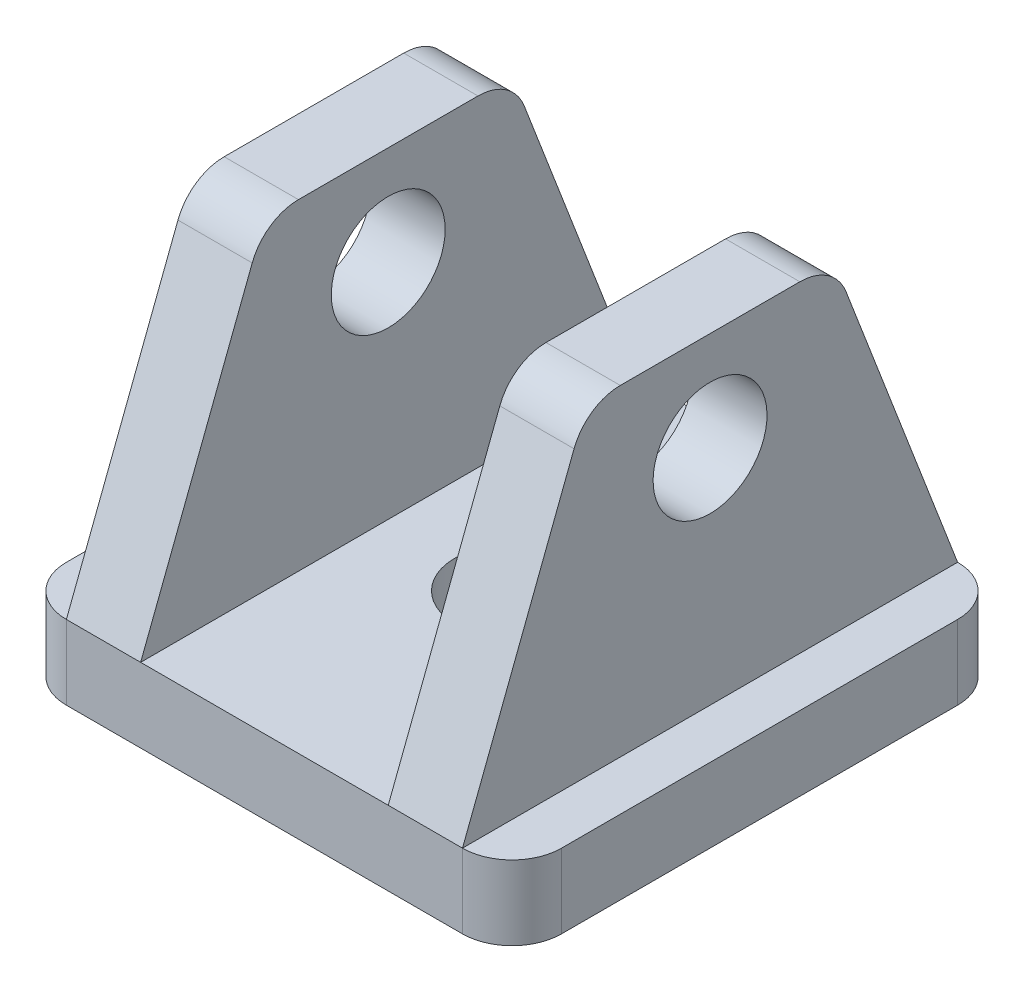
ISO-10303-21;
HEADER;
FILE_DESCRIPTION(('STEP AP214'),'2;1');
FILE_NAME('part.step','',(''),(''),'','','');
FILE_SCHEMA(('AUTOMOTIVE_DESIGN { 1 0 10303 214 1 1 1 1 }'));
ENDSEC;
DATA;
#1=APPLICATION_CONTEXT('core data for automotive mechanical design processes');
#2=APPLICATION_PROTOCOL_DEFINITION('international standard','automotive_design',2000,#1);
#3=PRODUCT_CONTEXT('',#1,'mechanical');
#4=PRODUCT('Part','Part','',(#3));
#5=PRODUCT_RELATED_PRODUCT_CATEGORY('part','',(#4));
#6=PRODUCT_DEFINITION_FORMATION('','',#4);
#7=PRODUCT_DEFINITION_CONTEXT('part definition',#1,'design');
#8=PRODUCT_DEFINITION('design','',#6,#7);
#9=PRODUCT_DEFINITION_SHAPE('','',#8);
#10=(LENGTH_UNIT() NAMED_UNIT(*) SI_UNIT(.MILLI.,.METRE.));
#11=(NAMED_UNIT(*) PLANE_ANGLE_UNIT() SI_UNIT($,.RADIAN.));
#12=(NAMED_UNIT(*) SI_UNIT($,.STERADIAN.) SOLID_ANGLE_UNIT());
#13=UNCERTAINTY_MEASURE_WITH_UNIT(LENGTH_MEASURE(1.E-05),#10,'distance_accuracy_value','');
#14=(GEOMETRIC_REPRESENTATION_CONTEXT(3) GLOBAL_UNCERTAINTY_ASSIGNED_CONTEXT((#13)) GLOBAL_UNIT_ASSIGNED_CONTEXT((#10,
#11,#12)) REPRESENTATION_CONTEXT('',''));
#15=CARTESIAN_POINT('',(0.,0.,0.));
#16=DIRECTION('',(0.,0.,1.));
#17=DIRECTION('',(1.,0.,0.));
#18=AXIS2_PLACEMENT_3D('',#15,#16,#17);
#19=CARTESIAN_POINT('',(0.,3.81,0.));
#20=DIRECTION('',(0.,-1.,0.));
#21=DIRECTION('',(0.,0.,-1.));
#22=AXIS2_PLACEMENT_3D('',#19,#20,#21);
#23=PLANE('',#22);
#24=CARTESIAN_POINT('',(22.86,3.81,-22.86));
#25=DIRECTION('',(0.,-1.,0.));
#26=DIRECTION('',(0.,0.,-1.));
#27=AXIS2_PLACEMENT_3D('',#24,#25,#26);
#28=CIRCLE('',#27,2.54);
#29=CARTESIAN_POINT('',(25.4,3.81,-22.86));
#30=VERTEX_POINT('',#29);
#31=CARTESIAN_POINT('',(22.86,3.81,-25.4));
#32=VERTEX_POINT('',#31);
#33=EDGE_CURVE('E218',#30,#32,#28,.F.);
#34=ORIENTED_EDGE('',*,*,#33,.T.);
#35=DIRECTION('',(0.,0.,1.));
#36=VECTOR('',#35,1.);
#37=CARTESIAN_POINT('',(22.86,3.81,-25.4));
#38=LINE('',#37,#36);
#39=CARTESIAN_POINT('',(22.86,3.81,0.));
#40=VERTEX_POINT('',#39);
#41=EDGE_CURVE('E199',#32,#40,#38,.T.);
#42=ORIENTED_EDGE('',*,*,#41,.T.);
#43=CARTESIAN_POINT('',(22.86,3.81,-2.54));
#44=DIRECTION('',(0.,-1.,0.));
#45=DIRECTION('',(0.,0.,-1.));
#46=AXIS2_PLACEMENT_3D('',#43,#44,#45);
#47=CIRCLE('',#46,2.54);
#48=CARTESIAN_POINT('',(25.4,3.81,-2.54));
#49=VERTEX_POINT('',#48);
#50=EDGE_CURVE('E215',#40,#49,#47,.F.);
#51=ORIENTED_EDGE('',*,*,#50,.T.);
#52=DIRECTION('',(0.,0.,-1.));
#53=VECTOR('',#52,1.);
#54=CARTESIAN_POINT('',(25.4,3.81,0.));
#55=LINE('',#54,#53);
#56=EDGE_CURVE('E414',#49,#30,#55,.T.);
#57=ORIENTED_EDGE('',*,*,#56,.T.);
#58=EDGE_LOOP('',(#34,#42,#51,#57));
#59=FACE_BOUND('',#58,.T.);
#60=ADVANCED_FACE('F59',(#59),#23,.F.);
#61=CARTESIAN_POINT('',(12.7,3.81,-12.7));
#62=DIRECTION('',(0.,1.,0.));
#63=DIRECTION('',(0.,0.,1.));
#64=AXIS2_PLACEMENT_3D('',#61,#62,#63);
#65=CIRCLE('',#64,2.921);
#66=CARTESIAN_POINT('',(12.7,3.81,-15.621));
#67=VERTEX_POINT('',#66);
#68=EDGE_CURVE('E395',#67,#67,#65,.T.);
#69=ORIENTED_EDGE('',*,*,#68,.F.);
#70=EDGE_LOOP('',(#69));
#71=FACE_BOUND('',#70,.T.);
#72=DIRECTION('',(1.,0.,0.));
#73=VECTOR('',#72,1.);
#74=CARTESIAN_POINT('',(0.,3.81,0.));
#75=LINE('',#74,#73);
#76=CARTESIAN_POINT('',(6.35,3.81,0.));
#77=VERTEX_POINT('',#76);
#78=CARTESIAN_POINT('',(19.05,3.81,0.));
#79=VERTEX_POINT('',#78);
#80=EDGE_CURVE('E410',#77,#79,#75,.T.);
#81=ORIENTED_EDGE('',*,*,#80,.T.);
#82=DIRECTION('',(0.,0.,1.));
#83=VECTOR('',#82,1.);
#84=CARTESIAN_POINT('',(19.05,3.81,-25.4));
#85=LINE('',#84,#83);
#86=CARTESIAN_POINT('',(19.05,3.81,-25.4));
#87=VERTEX_POINT('',#86);
#88=EDGE_CURVE('E200',#87,#79,#85,.T.);
#89=ORIENTED_EDGE('',*,*,#88,.F.);
#90=DIRECTION('',(-1.,0.,0.));
#91=VECTOR('',#90,1.);
#92=CARTESIAN_POINT('',(0.,3.81,-25.4));
#93=LINE('',#92,#91);
#94=CARTESIAN_POINT('',(6.35,3.81,-25.4));
#95=VERTEX_POINT('',#94);
#96=EDGE_CURVE('E258',#87,#95,#93,.T.);
#97=ORIENTED_EDGE('',*,*,#96,.T.);
#98=DIRECTION('',(0.,0.,1.));
#99=VECTOR('',#98,1.);
#100=CARTESIAN_POINT('',(6.35,3.81,-25.4));
#101=LINE('',#100,#99);
#102=EDGE_CURVE('E451',#95,#77,#101,.T.);
#103=ORIENTED_EDGE('',*,*,#102,.T.);
#104=EDGE_LOOP('',(#81,#89,#97,#103));
#105=FACE_BOUND('',#104,.T.);
#106=ADVANCED_FACE('F468',(#71,#105),#23,.F.);
#107=CARTESIAN_POINT('',(2.54,3.81,-2.54));
#108=DIRECTION('',(0.,-1.,0.));
#109=DIRECTION('',(0.,0.,-1.));
#110=AXIS2_PLACEMENT_3D('',#107,#108,#109);
#111=CIRCLE('',#110,2.54);
#112=CARTESIAN_POINT('',(0.,3.81,-2.54));
#113=VERTEX_POINT('',#112);
#114=CARTESIAN_POINT('',(2.54,3.81,0.));
#115=VERTEX_POINT('',#114);
#116=EDGE_CURVE('E237',#113,#115,#111,.F.);
#117=ORIENTED_EDGE('',*,*,#116,.T.);
#118=DIRECTION('',(0.,0.,1.));
#119=VECTOR('',#118,1.);
#120=CARTESIAN_POINT('',(2.54,3.81,-25.4));
#121=LINE('',#120,#119);
#122=CARTESIAN_POINT('',(2.54,3.81,-25.4));
#123=VERTEX_POINT('',#122);
#124=EDGE_CURVE('E447',#123,#115,#121,.T.);
#125=ORIENTED_EDGE('',*,*,#124,.F.);
#126=CARTESIAN_POINT('',(2.54,3.81,-22.86));
#127=DIRECTION('',(0.,-1.,0.));
#128=DIRECTION('',(0.,0.,-1.));
#129=AXIS2_PLACEMENT_3D('',#126,#127,#128);
#130=CIRCLE('',#129,2.54);
#131=CARTESIAN_POINT('',(0.,3.81,-22.86));
#132=VERTEX_POINT('',#131);
#133=EDGE_CURVE('E239',#123,#132,#130,.F.);
#134=ORIENTED_EDGE('',*,*,#133,.T.);
#135=DIRECTION('',(0.,0.,1.));
#136=VECTOR('',#135,1.);
#137=CARTESIAN_POINT('',(0.,3.81,0.));
#138=LINE('',#137,#136);
#139=EDGE_CURVE('E407',#132,#113,#138,.T.);
#140=ORIENTED_EDGE('',*,*,#139,.T.);
#141=EDGE_LOOP('',(#117,#125,#134,#140));
#142=FACE_BOUND('',#141,.T.);
#143=ADVANCED_FACE('F489',(#142),#23,.F.);
#144=CARTESIAN_POINT('',(0.,0.,0.));
#145=DIRECTION('',(0.,-1.,0.));
#146=DIRECTION('',(0.,0.,-1.));
#147=AXIS2_PLACEMENT_3D('',#144,#145,#146);
#148=PLANE('',#147);
#149=DIRECTION('',(0.,0.,1.));
#150=VECTOR('',#149,1.);
#151=CARTESIAN_POINT('',(0.,0.,0.));
#152=LINE('',#151,#150);
#153=CARTESIAN_POINT('',(0.,0.,-22.86));
#154=VERTEX_POINT('',#153);
#155=CARTESIAN_POINT('',(0.,0.,-2.54));
#156=VERTEX_POINT('',#155);
#157=EDGE_CURVE('E403',#154,#156,#152,.T.);
#158=ORIENTED_EDGE('',*,*,#157,.F.);
#159=CARTESIAN_POINT('',(2.54,0.,-22.86));
#160=DIRECTION('',(0.,-1.,0.));
#161=DIRECTION('',(0.,0.,-1.));
#162=AXIS2_PLACEMENT_3D('',#159,#160,#161);
#163=CIRCLE('',#162,2.54);
#164=CARTESIAN_POINT('',(2.54,0.,-25.4));
#165=VERTEX_POINT('',#164);
#166=EDGE_CURVE('E423',#154,#165,#163,.T.);
#167=ORIENTED_EDGE('',*,*,#166,.T.);
#168=DIRECTION('',(-1.,0.,0.));
#169=VECTOR('',#168,1.);
#170=CARTESIAN_POINT('',(0.,0.,-25.4));
#171=LINE('',#170,#169);
#172=CARTESIAN_POINT('',(22.86,0.,-25.4));
#173=VERTEX_POINT('',#172);
#174=EDGE_CURVE('E411',#173,#165,#171,.T.);
#175=ORIENTED_EDGE('',*,*,#174,.F.);
#176=CARTESIAN_POINT('',(22.86,0.,-22.86));
#177=DIRECTION('',(0.,-1.,0.));
#178=DIRECTION('',(0.,0.,-1.));
#179=AXIS2_PLACEMENT_3D('',#176,#177,#178);
#180=CIRCLE('',#179,2.54);
#181=CARTESIAN_POINT('',(25.4,0.,-22.86));
#182=VERTEX_POINT('',#181);
#183=EDGE_CURVE('E430',#173,#182,#180,.T.);
#184=ORIENTED_EDGE('',*,*,#183,.T.);
#185=DIRECTION('',(0.,0.,-1.));
#186=VECTOR('',#185,1.);
#187=CARTESIAN_POINT('',(25.4,0.,0.));
#188=LINE('',#187,#186);
#189=CARTESIAN_POINT('',(25.4,0.,-2.54));
#190=VERTEX_POINT('',#189);
#191=EDGE_CURVE('E506',#190,#182,#188,.T.);
#192=ORIENTED_EDGE('',*,*,#191,.F.);
#193=CARTESIAN_POINT('',(22.86,0.,-2.54));
#194=DIRECTION('',(0.,-1.,0.));
#195=DIRECTION('',(0.,0.,-1.));
#196=AXIS2_PLACEMENT_3D('',#193,#194,#195);
#197=CIRCLE('',#196,2.54);
#198=CARTESIAN_POINT('',(22.86,0.,0.));
#199=VERTEX_POINT('',#198);
#200=EDGE_CURVE('E434',#190,#199,#197,.T.);
#201=ORIENTED_EDGE('',*,*,#200,.T.);
#202=DIRECTION('',(1.,0.,0.));
#203=VECTOR('',#202,1.);
#204=CARTESIAN_POINT('',(0.,0.,0.));
#205=LINE('',#204,#203);
#206=CARTESIAN_POINT('',(2.54,0.,0.));
#207=VERTEX_POINT('',#206);
#208=EDGE_CURVE('E228',#207,#199,#205,.T.);
#209=ORIENTED_EDGE('',*,*,#208,.F.);
#210=CARTESIAN_POINT('',(2.54,0.,-2.54));
#211=DIRECTION('',(0.,-1.,0.));
#212=DIRECTION('',(0.,0.,-1.));
#213=AXIS2_PLACEMENT_3D('',#210,#211,#212);
#214=CIRCLE('',#213,2.54);
#215=EDGE_CURVE('E497',#207,#156,#214,.T.);
#216=ORIENTED_EDGE('',*,*,#215,.T.);
#217=EDGE_LOOP('',(#158,#167,#175,#184,#192,#201,#209,#216));
#218=FACE_BOUND('',#217,.T.);
#219=CARTESIAN_POINT('',(12.7,0.,-12.7));
#220=DIRECTION('',(0.,1.,0.));
#221=DIRECTION('',(0.,0.,1.));
#222=AXIS2_PLACEMENT_3D('',#219,#220,#221);
#223=CIRCLE('',#222,2.921);
#224=CARTESIAN_POINT('',(12.7,0.,-15.621));
#225=VERTEX_POINT('',#224);
#226=EDGE_CURVE('E404',#225,#225,#223,.T.);
#227=ORIENTED_EDGE('',*,*,#226,.T.);
#228=EDGE_LOOP('',(#227));
#229=FACE_BOUND('',#228,.T.);
#230=ADVANCED_FACE('F503',(#218,#229),#148,.T.);
#231=CARTESIAN_POINT('',(0.,3.81,0.));
#232=DIRECTION('',(1.,0.,0.));
#233=DIRECTION('',(0.,0.,-1.));
#234=AXIS2_PLACEMENT_3D('',#231,#232,#233);
#235=PLANE('',#234);
#236=ORIENTED_EDGE('',*,*,#139,.F.);
#237=DIRECTION('',(0.,-1.,0.));
#238=VECTOR('',#237,1.);
#239=CARTESIAN_POINT('',(0.,3.81,-22.86));
#240=LINE('',#239,#238);
#241=EDGE_CURVE('E486',#132,#154,#240,.T.);
#242=ORIENTED_EDGE('',*,*,#241,.T.);
#243=ORIENTED_EDGE('',*,*,#157,.T.);
#244=DIRECTION('',(0.,-1.,0.));
#245=VECTOR('',#244,1.);
#246=CARTESIAN_POINT('',(0.,3.81,-2.54));
#247=LINE('',#246,#245);
#248=EDGE_CURVE('E257',#156,#113,#247,.F.);
#249=ORIENTED_EDGE('',*,*,#248,.T.);
#250=EDGE_LOOP('',(#236,#242,#243,#249));
#251=FACE_BOUND('',#250,.T.);
#252=ADVANCED_FACE('F492',(#251),#235,.F.);
#253=CARTESIAN_POINT('',(0.,3.81,0.));
#254=DIRECTION('',(0.,0.,-1.));
#255=DIRECTION('',(-1.,0.,0.));
#256=AXIS2_PLACEMENT_3D('',#253,#254,#255);
#257=PLANE('',#256);
#258=ORIENTED_EDGE('',*,*,#208,.T.);
#259=DIRECTION('',(0.,-1.,0.));
#260=VECTOR('',#259,1.);
#261=CARTESIAN_POINT('',(22.86,3.81,0.));
#262=LINE('',#261,#260);
#263=EDGE_CURVE('E224',#199,#40,#262,.F.);
#264=ORIENTED_EDGE('',*,*,#263,.T.);
#265=DIRECTION('',(-1.,0.,0.));
#266=VECTOR('',#265,1.);
#267=CARTESIAN_POINT('',(22.86,3.81,0.));
#268=LINE('',#267,#266);
#269=EDGE_CURVE('E188',#40,#79,#268,.T.);
#270=ORIENTED_EDGE('',*,*,#269,.T.);
#271=ORIENTED_EDGE('',*,*,#80,.F.);
#272=DIRECTION('',(1.,0.,0.));
#273=VECTOR('',#272,1.);
#274=CARTESIAN_POINT('',(0.,3.81,0.));
#275=LINE('',#274,#273);
#276=EDGE_CURVE('E418',#115,#77,#275,.T.);
#277=ORIENTED_EDGE('',*,*,#276,.F.);
#278=DIRECTION('',(0.,-1.,0.));
#279=VECTOR('',#278,1.);
#280=CARTESIAN_POINT('',(2.54,3.81,0.));
#281=LINE('',#280,#279);
#282=EDGE_CURVE('E231',#115,#207,#281,.T.);
#283=ORIENTED_EDGE('',*,*,#282,.T.);
#284=EDGE_LOOP('',(#258,#264,#270,#271,#277,#283));
#285=FACE_BOUND('',#284,.T.);
#286=ADVANCED_FACE('F225',(#285),#257,.F.);
#287=CARTESIAN_POINT('',(25.4,3.81,0.));
#288=DIRECTION('',(-1.,0.,0.));
#289=DIRECTION('',(0.,0.,1.));
#290=AXIS2_PLACEMENT_3D('',#287,#288,#289);
#291=PLANE('',#290);
#292=ORIENTED_EDGE('',*,*,#191,.T.);
#293=DIRECTION('',(0.,-1.,0.));
#294=VECTOR('',#293,1.);
#295=CARTESIAN_POINT('',(25.4,3.81,-22.86));
#296=LINE('',#295,#294);
#297=EDGE_CURVE('E439',#182,#30,#296,.F.);
#298=ORIENTED_EDGE('',*,*,#297,.T.);
#299=ORIENTED_EDGE('',*,*,#56,.F.);
#300=DIRECTION('',(0.,-1.,0.));
#301=VECTOR('',#300,1.);
#302=CARTESIAN_POINT('',(25.4,3.81,-2.54));
#303=LINE('',#302,#301);
#304=EDGE_CURVE('E236',#49,#190,#303,.T.);
#305=ORIENTED_EDGE('',*,*,#304,.T.);
#306=EDGE_LOOP('',(#292,#298,#299,#305));
#307=FACE_BOUND('',#306,.T.);
#308=ADVANCED_FACE('F508',(#307),#291,.F.);
#309=CARTESIAN_POINT('',(0.,3.81,-25.4));
#310=DIRECTION('',(0.,0.,1.));
#311=DIRECTION('',(1.,0.,0.));
#312=AXIS2_PLACEMENT_3D('',#309,#310,#311);
#313=PLANE('',#312);
#314=ORIENTED_EDGE('',*,*,#174,.T.);
#315=DIRECTION('',(0.,-1.,0.));
#316=VECTOR('',#315,1.);
#317=CARTESIAN_POINT('',(2.54,3.81,-25.4));
#318=LINE('',#317,#316);
#319=EDGE_CURVE('E242',#165,#123,#318,.F.);
#320=ORIENTED_EDGE('',*,*,#319,.T.);
#321=DIRECTION('',(1.,0.,0.));
#322=VECTOR('',#321,1.);
#323=CARTESIAN_POINT('',(2.54,3.81,-25.4));
#324=LINE('',#323,#322);
#325=EDGE_CURVE('E456',#123,#95,#324,.T.);
#326=ORIENTED_EDGE('',*,*,#325,.T.);
#327=ORIENTED_EDGE('',*,*,#96,.F.);
#328=DIRECTION('',(1.,0.,0.));
#329=VECTOR('',#328,1.);
#330=CARTESIAN_POINT('',(0.,3.81,-25.4));
#331=LINE('',#330,#329);
#332=EDGE_CURVE('E255',#32,#87,#331,.F.);
#333=ORIENTED_EDGE('',*,*,#332,.F.);
#334=DIRECTION('',(0.,-1.,0.));
#335=VECTOR('',#334,1.);
#336=CARTESIAN_POINT('',(22.86,3.81,-25.4));
#337=LINE('',#336,#335);
#338=EDGE_CURVE('E421',#32,#173,#337,.T.);
#339=ORIENTED_EDGE('',*,*,#338,.T.);
#340=EDGE_LOOP('',(#314,#320,#326,#327,#333,#339));
#341=FACE_BOUND('',#340,.T.);
#342=ADVANCED_FACE('F479',(#341),#313,.F.);
#343=CARTESIAN_POINT('',(12.7,3.81,-12.7));
#344=DIRECTION('',(0.,-1.,0.));
#345=DIRECTION('',(0.,0.,-1.));
#346=AXIS2_PLACEMENT_3D('',#343,#344,#345);
#347=CYLINDRICAL_SURFACE('',#346,2.921);
#348=CARTESIAN_POINT('',(12.7,3.81,-15.621));
#349=CARTESIAN_POINT('',(12.7,3.7703125,-15.621));
#350=CARTESIAN_POINT('',(12.7,3.730625,-15.621));
#351=CARTESIAN_POINT('',(12.7,3.65125,-15.621));
#352=CARTESIAN_POINT('',(12.7,3.6115625,-15.621));
#353=CARTESIAN_POINT('',(12.7,3.5321875,-15.621));
#354=CARTESIAN_POINT('',(12.7,3.4925,-15.621));
#355=CARTESIAN_POINT('',(12.7,3.413125,-15.621));
#356=CARTESIAN_POINT('',(12.7,3.3734375,-15.621));
#357=CARTESIAN_POINT('',(12.7,3.2940625,-15.621));
#358=CARTESIAN_POINT('',(12.7,3.254375,-15.621));
#359=CARTESIAN_POINT('',(12.7,3.175,-15.621));
#360=CARTESIAN_POINT('',(12.7,3.1353125,-15.621));
#361=CARTESIAN_POINT('',(12.7,3.0559375,-15.621));
#362=CARTESIAN_POINT('',(12.7,3.01625,-15.621));
#363=CARTESIAN_POINT('',(12.7,2.936875,-15.621));
#364=CARTESIAN_POINT('',(12.7,2.8971875,-15.621));
#365=CARTESIAN_POINT('',(12.7,2.8178125,-15.621));
#366=CARTESIAN_POINT('',(12.7,2.778125,-15.621));
#367=CARTESIAN_POINT('',(12.7,2.69875,-15.621));
#368=CARTESIAN_POINT('',(12.7,2.6590625,-15.621));
#369=CARTESIAN_POINT('',(12.7,2.5796875,-15.621));
#370=CARTESIAN_POINT('',(12.7,2.54,-15.621));
#371=CARTESIAN_POINT('',(12.7,2.460625,-15.621));
#372=CARTESIAN_POINT('',(12.7,2.4209375,-15.621));
#373=CARTESIAN_POINT('',(12.7,2.3415625,-15.621));
#374=CARTESIAN_POINT('',(12.7,2.301875,-15.621));
#375=CARTESIAN_POINT('',(12.7,2.2225,-15.621));
#376=CARTESIAN_POINT('',(12.7,2.1828125,-15.621));
#377=CARTESIAN_POINT('',(12.7,2.1034375,-15.621));
#378=CARTESIAN_POINT('',(12.7,2.06375,-15.621));
#379=CARTESIAN_POINT('',(12.7,1.984375,-15.621));
#380=CARTESIAN_POINT('',(12.7,1.9446875,-15.621));
#381=CARTESIAN_POINT('',(12.7,1.8653125,-15.621));
#382=CARTESIAN_POINT('',(12.7,1.825625,-15.621));
#383=CARTESIAN_POINT('',(12.7,1.74625,-15.621));
#384=CARTESIAN_POINT('',(12.7,1.7065625,-15.621));
#385=CARTESIAN_POINT('',(12.7,1.6271875,-15.621));
#386=CARTESIAN_POINT('',(12.7,1.5875,-15.621));
#387=CARTESIAN_POINT('',(12.7,1.508125,-15.621));
#388=CARTESIAN_POINT('',(12.7,1.4684375,-15.621));
#389=CARTESIAN_POINT('',(12.7,1.3890625,-15.621));
#390=CARTESIAN_POINT('',(12.7,1.349375,-15.621));
#391=CARTESIAN_POINT('',(12.7,1.27,-15.621));
#392=CARTESIAN_POINT('',(12.7,1.2303125,-15.621));
#393=CARTESIAN_POINT('',(12.7,1.1509375,-15.621));
#394=CARTESIAN_POINT('',(12.7,1.11125,-15.621));
#395=CARTESIAN_POINT('',(12.7,1.031875,-15.621));
#396=CARTESIAN_POINT('',(12.7,0.9921875,-15.621));
#397=CARTESIAN_POINT('',(12.7,0.9128125,-15.621));
#398=CARTESIAN_POINT('',(12.7,0.873125,-15.621));
#399=CARTESIAN_POINT('',(12.7,0.79375,-15.621));
#400=CARTESIAN_POINT('',(12.7,0.7540625,-15.621));
#401=CARTESIAN_POINT('',(12.7,0.6746875,-15.621));
#402=CARTESIAN_POINT('',(12.7,0.635,-15.621));
#403=CARTESIAN_POINT('',(12.7,0.555625,-15.621));
#404=CARTESIAN_POINT('',(12.7,0.5159375,-15.621));
#405=CARTESIAN_POINT('',(12.7,0.4365625,-15.621));
#406=CARTESIAN_POINT('',(12.7,0.396875,-15.621));
#407=CARTESIAN_POINT('',(12.7,0.3175,-15.621));
#408=CARTESIAN_POINT('',(12.7,0.2778125,-15.621));
#409=CARTESIAN_POINT('',(12.7,0.1984375,-15.621));
#410=CARTESIAN_POINT('',(12.7,0.15875,-15.621));
#411=CARTESIAN_POINT('',(12.7,0.0793749999999999,-15.621));
#412=CARTESIAN_POINT('',(12.7,0.0396874999999999,-15.621));
#413=CARTESIAN_POINT('',(12.7,0.,-15.621));
#414=B_SPLINE_CURVE_WITH_KNOTS('',3,(#348,#349,#350,#351,#352,#353,#354,#355,#356,#357,#358,
#359,#360,#361,#362,#363,#364,#365,#366,#367,#368,#369,#370,#371,#372,#373,#374,#375,#376,#377,
#378,#379,#380,#381,#382,#383,#384,#385,#386,#387,#388,#389,#390,#391,#392,#393,#394,#395,#396,
#397,#398,#399,#400,#401,#402,#403,#404,#405,#406,#407,#408,#409,#410,#411,#412,#413),
.UNSPECIFIED.,.F.,.F.,(4,2,2,2,2,2,2,2,2,2,2,2,2,2,2,2,2,2,2,2,2,2,2,2,2,2,2,2,2,2,2,2,4),(0.,
0.1190625,0.238125,0.3571875,0.47625,0.595312499999999,0.714375,0.833437499999999,
0.952499999999999,1.0715625,1.190625,1.3096875,1.42875,1.5478125,1.666875,1.7859375,1.905,
2.0240625,2.143125,2.2621875,2.38125,2.5003125,2.619375,2.7384375,2.8575,2.9765625,3.095625,
3.2146875,3.33375,3.4528125,3.571875,3.6909375,3.81),.UNSPECIFIED.);
#415=EDGE_CURVE('BSEAM389',#67,#225,#414,.T.);
#416=ORIENTED_EDGE('',*,*,#68,.T.);
#417=ORIENTED_EDGE('',*,*,#226,.F.);
#418=ORIENTED_EDGE('',*,*,#415,.T.);
#419=ORIENTED_EDGE('',*,*,#415,.F.);
#420=EDGE_LOOP('',(#416,#418,#417,#419));
#421=FACE_BOUND('',#420,.T.);
#422=ADVANCED_FACE('F389',(#421),#347,.F.);
#423=CARTESIAN_POINT('',(2.54,3.81,-22.86));
#424=DIRECTION('',(0.,-1.,0.));
#425=DIRECTION('',(0.,0.,-1.));
#426=AXIS2_PLACEMENT_3D('',#423,#424,#425);
#427=CYLINDRICAL_SURFACE('',#426,2.54);
#428=ORIENTED_EDGE('',*,*,#133,.F.);
#429=ORIENTED_EDGE('',*,*,#319,.F.);
#430=ORIENTED_EDGE('',*,*,#166,.F.);
#431=ORIENTED_EDGE('',*,*,#241,.F.);
#432=EDGE_LOOP('',(#428,#429,#430,#431));
#433=FACE_BOUND('',#432,.T.);
#434=ADVANCED_FACE('F484',(#433),#427,.T.);
#435=CARTESIAN_POINT('',(22.86,3.81,-22.86));
#436=DIRECTION('',(0.,-1.,0.));
#437=DIRECTION('',(0.,0.,-1.));
#438=AXIS2_PLACEMENT_3D('',#435,#436,#437);
#439=CYLINDRICAL_SURFACE('',#438,2.54);
#440=ORIENTED_EDGE('',*,*,#33,.F.);
#441=ORIENTED_EDGE('',*,*,#297,.F.);
#442=ORIENTED_EDGE('',*,*,#183,.F.);
#443=ORIENTED_EDGE('',*,*,#338,.F.);
#444=EDGE_LOOP('',(#440,#441,#442,#443));
#445=FACE_BOUND('',#444,.T.);
#446=ADVANCED_FACE('F511',(#445),#439,.T.);
#447=CARTESIAN_POINT('',(22.86,3.81,-2.54));
#448=DIRECTION('',(0.,-1.,0.));
#449=DIRECTION('',(0.,0.,-1.));
#450=AXIS2_PLACEMENT_3D('',#447,#448,#449);
#451=CYLINDRICAL_SURFACE('',#450,2.54);
#452=ORIENTED_EDGE('',*,*,#50,.F.);
#453=ORIENTED_EDGE('',*,*,#263,.F.);
#454=ORIENTED_EDGE('',*,*,#200,.F.);
#455=ORIENTED_EDGE('',*,*,#304,.F.);
#456=EDGE_LOOP('',(#452,#453,#454,#455));
#457=FACE_BOUND('',#456,.T.);
#458=ADVANCED_FACE('F234',(#457),#451,.T.);
#459=CARTESIAN_POINT('',(2.54,3.81,-2.54));
#460=DIRECTION('',(0.,-1.,0.));
#461=DIRECTION('',(0.,0.,-1.));
#462=AXIS2_PLACEMENT_3D('',#459,#460,#461);
#463=CYLINDRICAL_SURFACE('',#462,2.54);
#464=ORIENTED_EDGE('',*,*,#116,.F.);
#465=ORIENTED_EDGE('',*,*,#248,.F.);
#466=ORIENTED_EDGE('',*,*,#215,.F.);
#467=ORIENTED_EDGE('',*,*,#282,.F.);
#468=EDGE_LOOP('',(#464,#465,#466,#467));
#469=FACE_BOUND('',#468,.T.);
#470=ADVANCED_FACE('F385',(#469),#463,.T.);
#471=CARTESIAN_POINT('',(0.,20.32,0.));
#472=DIRECTION('',(0.,-1.,0.));
#473=DIRECTION('',(0.,0.,-1.));
#474=AXIS2_PLACEMENT_3D('',#471,#472,#473);
#475=PLANE('',#474);
#476=DIRECTION('',(0.,0.,1.));
#477=VECTOR('',#476,1.);
#478=CARTESIAN_POINT('',(6.35,20.32,-19.05));
#479=LINE('',#478,#477);
#480=CARTESIAN_POINT('',(6.35,20.32,-17.3055302904579));
#481=VERTEX_POINT('',#480);
#482=CARTESIAN_POINT('',(6.35,20.32,-8.09446970954213));
#483=VERTEX_POINT('',#482);
#484=EDGE_CURVE('E353',#481,#483,#479,.T.);
#485=ORIENTED_EDGE('',*,*,#484,.F.);
#486=DIRECTION('',(1.,0.,0.));
#487=VECTOR('',#486,1.);
#488=CARTESIAN_POINT('',(2.54,20.32,-17.3055302904579));
#489=LINE('',#488,#487);
#490=CARTESIAN_POINT('',(2.54,20.32,-17.3055302904579));
#491=VERTEX_POINT('',#490);
#492=EDGE_CURVE('E737',#481,#491,#489,.F.);
#493=ORIENTED_EDGE('',*,*,#492,.T.);
#494=DIRECTION('',(0.,0.,1.));
#495=VECTOR('',#494,1.);
#496=CARTESIAN_POINT('',(2.54,20.32,-19.05));
#497=LINE('',#496,#495);
#498=CARTESIAN_POINT('',(2.54,20.32,-8.09446970954213));
#499=VERTEX_POINT('',#498);
#500=EDGE_CURVE('E63',#491,#499,#497,.T.);
#501=ORIENTED_EDGE('',*,*,#500,.T.);
#502=DIRECTION('',(1.,0.,0.));
#503=VECTOR('',#502,1.);
#504=CARTESIAN_POINT('',(0.,20.32,-8.09446970954213));
#505=LINE('',#504,#503);
#506=EDGE_CURVE('E736',#499,#483,#505,.T.);
#507=ORIENTED_EDGE('',*,*,#506,.T.);
#508=EDGE_LOOP('',(#485,#493,#501,#507));
#509=FACE_BOUND('',#508,.T.);
#510=ADVANCED_FACE('F376',(#509),#475,.F.);
#511=CARTESIAN_POINT('',(6.35,0.,0.));
#512=DIRECTION('',(1.,0.,0.));
#513=DIRECTION('',(0.,0.,-1.));
#514=AXIS2_PLACEMENT_3D('',#511,#512,#513);
#515=PLANE('',#514);
#516=CARTESIAN_POINT('',(6.35,15.24,-12.7));
#517=DIRECTION('',(1.,0.,0.));
#518=DIRECTION('',(0.,0.,-1.));
#519=AXIS2_PLACEMENT_3D('',#516,#517,#518);
#520=CIRCLE('',#519,2.921);
#521=CARTESIAN_POINT('',(6.35,15.24,-15.621));
#522=VERTEX_POINT('',#521);
#523=EDGE_CURVE('E250',#522,#522,#520,.T.);
#524=ORIENTED_EDGE('',*,*,#523,.F.);
#525=EDGE_LOOP('',(#524));
#526=FACE_BOUND('',#525,.T.);
#527=DIRECTION('',(0.,0.93334560620306,0.358979079308869));
#528=VECTOR('',#527,1.);
#529=CARTESIAN_POINT('',(6.35,3.81,-25.4));
#530=LINE('',#529,#528);
#531=CARTESIAN_POINT('',(6.35,18.6918068614445,-19.6762281302136));
#532=VERTEX_POINT('',#531);
#533=EDGE_CURVE('E450',#95,#532,#530,.T.);
#534=ORIENTED_EDGE('',*,*,#533,.T.);
#535=CARTESIAN_POINT('',(6.35,17.78,-17.3055302904579));
#536=DIRECTION('',(1.,0.,0.));
#537=DIRECTION('',(0.,0.,-1.));
#538=AXIS2_PLACEMENT_3D('',#535,#536,#537);
#539=CIRCLE('',#538,2.54);
#540=EDGE_CURVE('E760',#532,#481,#539,.T.);
#541=ORIENTED_EDGE('',*,*,#540,.T.);
#542=ORIENTED_EDGE('',*,*,#484,.T.);
#543=CARTESIAN_POINT('',(6.35,17.78,-8.09446970954213));
#544=DIRECTION('',(1.,0.,0.));
#545=DIRECTION('',(0.,0.,-1.));
#546=AXIS2_PLACEMENT_3D('',#543,#544,#545);
#547=CIRCLE('',#546,2.54);
#548=CARTESIAN_POINT('',(6.35,18.6918068614445,-5.72377186978636));
#549=VERTEX_POINT('',#548);
#550=EDGE_CURVE('E347',#483,#549,#547,.T.);
#551=ORIENTED_EDGE('',*,*,#550,.T.);
#552=DIRECTION('',(0.,0.93334560620306,-0.358979079308869));
#553=VECTOR('',#552,1.);
#554=CARTESIAN_POINT('',(6.35,3.81,0.));
#555=LINE('',#554,#553);
#556=EDGE_CURVE('E471',#77,#549,#555,.T.);
#557=ORIENTED_EDGE('',*,*,#556,.F.);
#558=ORIENTED_EDGE('',*,*,#102,.F.);
#559=EDGE_LOOP('',(#534,#541,#542,#551,#557,#558));
#560=FACE_BOUND('',#559,.T.);
#561=ADVANCED_FACE('F299',(#526,#560),#515,.T.);
#562=CARTESIAN_POINT('',(0.,0.4909793814433,1.27654639175258));
#563=DIRECTION('',(0.,-0.358979079308869,-0.93334560620306));
#564=DIRECTION('',(0.,0.93334560620306,-0.358979079308869));
#565=AXIS2_PLACEMENT_3D('',#562,#563,#564);
#566=PLANE('',#565);
#567=ORIENTED_EDGE('',*,*,#556,.T.);
#568=DIRECTION('',(1.,0.,0.));
#569=VECTOR('',#568,1.);
#570=CARTESIAN_POINT('',(0.,18.6918068614445,-5.72377186978636));
#571=LINE('',#570,#569);
#572=CARTESIAN_POINT('',(2.54,18.6918068614445,-5.72377186978636));
#573=VERTEX_POINT('',#572);
#574=EDGE_CURVE('E12',#549,#573,#571,.F.);
#575=ORIENTED_EDGE('',*,*,#574,.T.);
#576=DIRECTION('',(0.,0.93334560620306,-0.358979079308869));
#577=VECTOR('',#576,1.);
#578=CARTESIAN_POINT('',(2.54,3.81,0.));
#579=LINE('',#578,#577);
#580=EDGE_CURVE('E749',#115,#573,#579,.T.);
#581=ORIENTED_EDGE('',*,*,#580,.F.);
#582=ORIENTED_EDGE('',*,*,#276,.T.);
#583=EDGE_LOOP('',(#567,#575,#581,#582));
#584=FACE_BOUND('',#583,.T.);
#585=ADVANCED_FACE('F611',(#584),#566,.F.);
#586=CARTESIAN_POINT('',(0.,9.00128865979382,-23.4033505154639));
#587=DIRECTION('',(0.,0.358979079308869,-0.93334560620306));
#588=DIRECTION('',(0.,0.93334560620306,0.358979079308869));
#589=AXIS2_PLACEMENT_3D('',#586,#587,#588);
#590=PLANE('',#589);
#591=DIRECTION('',(0.,0.93334560620306,0.358979079308869));
#592=VECTOR('',#591,1.);
#593=CARTESIAN_POINT('',(2.54,3.81,-25.4));
#594=LINE('',#593,#592);
#595=CARTESIAN_POINT('',(2.54,18.6918068614445,-19.6762281302136));
#596=VERTEX_POINT('',#595);
#597=EDGE_CURVE('E306',#123,#596,#594,.T.);
#598=ORIENTED_EDGE('',*,*,#597,.T.);
#599=DIRECTION('',(1.,0.,0.));
#600=VECTOR('',#599,1.);
#601=CARTESIAN_POINT('',(6.35,18.6918068614445,-19.6762281302136));
#602=LINE('',#601,#600);
#603=EDGE_CURVE('E344',#596,#532,#602,.T.);
#604=ORIENTED_EDGE('',*,*,#603,.T.);
#605=ORIENTED_EDGE('',*,*,#533,.F.);
#606=ORIENTED_EDGE('',*,*,#325,.F.);
#607=EDGE_LOOP('',(#598,#604,#605,#606));
#608=FACE_BOUND('',#607,.T.);
#609=ADVANCED_FACE('F475',(#608),#590,.T.);
#610=CARTESIAN_POINT('',(2.54,0.,0.));
#611=DIRECTION('',(1.,0.,0.));
#612=DIRECTION('',(0.,1.,0.));
#613=AXIS2_PLACEMENT_3D('',#610,#611,#612);
#614=PLANE('',#613);
#615=CARTESIAN_POINT('',(2.54,15.24,-12.7));
#616=DIRECTION('',(-1.,0.,0.));
#617=DIRECTION('',(0.,-1.,0.));
#618=AXIS2_PLACEMENT_3D('',#615,#616,#617);
#619=CIRCLE('',#618,2.921);
#620=CARTESIAN_POINT('',(2.54,12.319,-12.7));
#621=VERTEX_POINT('',#620);
#622=EDGE_CURVE('E266',#621,#621,#619,.T.);
#623=ORIENTED_EDGE('',*,*,#622,.F.);
#624=EDGE_LOOP('',(#623));
#625=FACE_BOUND('',#624,.T.);
#626=ORIENTED_EDGE('',*,*,#500,.F.);
#627=CARTESIAN_POINT('',(2.54,17.78,-17.3055302904579));
#628=DIRECTION('',(1.,0.,0.));
#629=DIRECTION('',(0.,1.,0.));
#630=AXIS2_PLACEMENT_3D('',#627,#628,#629);
#631=CIRCLE('',#630,2.54);
#632=EDGE_CURVE('E69',#491,#596,#631,.F.);
#633=ORIENTED_EDGE('',*,*,#632,.T.);
#634=ORIENTED_EDGE('',*,*,#597,.F.);
#635=ORIENTED_EDGE('',*,*,#124,.T.);
#636=ORIENTED_EDGE('',*,*,#580,.T.);
#637=CARTESIAN_POINT('',(2.54,17.78,-8.09446970954213));
#638=DIRECTION('',(1.,0.,0.));
#639=DIRECTION('',(0.,1.,0.));
#640=AXIS2_PLACEMENT_3D('',#637,#638,#639);
#641=CIRCLE('',#640,2.54);
#642=EDGE_CURVE('E82',#573,#499,#641,.F.);
#643=ORIENTED_EDGE('',*,*,#642,.T.);
#644=EDGE_LOOP('',(#626,#633,#634,#635,#636,#643));
#645=FACE_BOUND('',#644,.T.);
#646=ADVANCED_FACE('F297',(#625,#645),#614,.F.);
#647=CARTESIAN_POINT('',(0.,20.32,0.));
#648=DIRECTION('',(0.,-1.,0.));
#649=DIRECTION('',(0.,0.,-1.));
#650=AXIS2_PLACEMENT_3D('',#647,#648,#649);
#651=PLANE('',#650);
#652=DIRECTION('',(0.,0.,1.));
#653=VECTOR('',#652,1.);
#654=CARTESIAN_POINT('',(19.05,20.32,-19.05));
#655=LINE('',#654,#653);
#656=CARTESIAN_POINT('',(19.05,20.32,-17.3055302904579));
#657=VERTEX_POINT('',#656);
#658=CARTESIAN_POINT('',(19.05,20.32,-8.09446970954213));
#659=VERTEX_POINT('',#658);
#660=EDGE_CURVE('E273',#657,#659,#655,.T.);
#661=ORIENTED_EDGE('',*,*,#660,.T.);
#662=DIRECTION('',(1.,0.,0.));
#663=VECTOR('',#662,1.);
#664=CARTESIAN_POINT('',(0.,20.32,-8.09446970954213));
#665=LINE('',#664,#663);
#666=CARTESIAN_POINT('',(22.86,20.32,-8.09446970954213));
#667=VERTEX_POINT('',#666);
#668=EDGE_CURVE('E318',#659,#667,#665,.T.);
#669=ORIENTED_EDGE('',*,*,#668,.T.);
#670=DIRECTION('',(0.,0.,1.));
#671=VECTOR('',#670,1.);
#672=CARTESIAN_POINT('',(22.86,20.32,-19.05));
#673=LINE('',#672,#671);
#674=CARTESIAN_POINT('',(22.86,20.32,-17.3055302904579));
#675=VERTEX_POINT('',#674);
#676=EDGE_CURVE('E210',#675,#667,#673,.T.);
#677=ORIENTED_EDGE('',*,*,#676,.F.);
#678=DIRECTION('',(1.,0.,0.));
#679=VECTOR('',#678,1.);
#680=CARTESIAN_POINT('',(19.05,20.32,-17.3055302904579));
#681=LINE('',#680,#679);
#682=EDGE_CURVE('E230',#675,#657,#681,.F.);
#683=ORIENTED_EDGE('',*,*,#682,.T.);
#684=EDGE_LOOP('',(#661,#669,#677,#683));
#685=FACE_BOUND('',#684,.T.);
#686=ADVANCED_FACE('F286',(#685),#651,.F.);
#687=CARTESIAN_POINT('',(0.,9.00128865979382,-23.4033505154639));
#688=DIRECTION('',(0.,0.358979079308869,-0.93334560620306));
#689=DIRECTION('',(0.,0.93334560620306,0.358979079308869));
#690=AXIS2_PLACEMENT_3D('',#687,#688,#689);
#691=PLANE('',#690);
#692=DIRECTION('',(0.,0.93334560620306,0.358979079308869));
#693=VECTOR('',#692,1.);
#694=CARTESIAN_POINT('',(19.05,3.81,-25.4));
#695=LINE('',#694,#693);
#696=CARTESIAN_POINT('',(19.05,18.6918068614445,-19.6762281302136));
#697=VERTEX_POINT('',#696);
#698=EDGE_CURVE('E220',#87,#697,#695,.T.);
#699=ORIENTED_EDGE('',*,*,#698,.T.);
#700=DIRECTION('',(1.,0.,0.));
#701=VECTOR('',#700,1.);
#702=CARTESIAN_POINT('',(22.86,18.6918068614445,-19.6762281302136));
#703=LINE('',#702,#701);
#704=CARTESIAN_POINT('',(22.86,18.6918068614445,-19.6762281302136));
#705=VERTEX_POINT('',#704);
#706=EDGE_CURVE('E339',#697,#705,#703,.T.);
#707=ORIENTED_EDGE('',*,*,#706,.T.);
#708=DIRECTION('',(0.,0.93334560620306,0.358979079308869));
#709=VECTOR('',#708,1.);
#710=CARTESIAN_POINT('',(22.86,3.81,-25.4));
#711=LINE('',#710,#709);
#712=EDGE_CURVE('E771',#32,#705,#711,.T.);
#713=ORIENTED_EDGE('',*,*,#712,.F.);
#714=ORIENTED_EDGE('',*,*,#332,.T.);
#715=EDGE_LOOP('',(#699,#707,#713,#714));
#716=FACE_BOUND('',#715,.T.);
#717=ADVANCED_FACE('F296',(#716),#691,.T.);
#718=CARTESIAN_POINT('',(22.86,0.,0.));
#719=DIRECTION('',(1.,0.,0.));
#720=DIRECTION('',(0.,0.,-1.));
#721=AXIS2_PLACEMENT_3D('',#718,#719,#720);
#722=PLANE('',#721);
#723=CARTESIAN_POINT('',(22.86,15.24,-12.7));
#724=DIRECTION('',(1.,0.,0.));
#725=DIRECTION('',(0.,0.,-1.));
#726=AXIS2_PLACEMENT_3D('',#723,#724,#725);
#727=CIRCLE('',#726,2.921);
#728=CARTESIAN_POINT('',(22.86,12.319,-12.7));
#729=VERTEX_POINT('',#728);
#730=EDGE_CURVE('E265',#729,#729,#727,.T.);
#731=ORIENTED_EDGE('',*,*,#730,.F.);
#732=EDGE_LOOP('',(#731));
#733=FACE_BOUND('',#732,.T.);
#734=ORIENTED_EDGE('',*,*,#676,.T.);
#735=CARTESIAN_POINT('',(22.86,17.78,-8.09446970954213));
#736=DIRECTION('',(1.,0.,0.));
#737=DIRECTION('',(0.,0.,-1.));
#738=AXIS2_PLACEMENT_3D('',#735,#736,#737);
#739=CIRCLE('',#738,2.54);
#740=CARTESIAN_POINT('',(22.86,18.6918068614445,-5.72377186978636));
#741=VERTEX_POINT('',#740);
#742=EDGE_CURVE('E209',#667,#741,#739,.T.);
#743=ORIENTED_EDGE('',*,*,#742,.T.);
#744=DIRECTION('',(0.,0.93334560620306,-0.358979079308869));
#745=VECTOR('',#744,1.);
#746=CARTESIAN_POINT('',(22.86,3.81,0.));
#747=LINE('',#746,#745);
#748=EDGE_CURVE('E191',#40,#741,#747,.T.);
#749=ORIENTED_EDGE('',*,*,#748,.F.);
#750=ORIENTED_EDGE('',*,*,#41,.F.);
#751=ORIENTED_EDGE('',*,*,#712,.T.);
#752=CARTESIAN_POINT('',(22.86,17.78,-17.3055302904579));
#753=DIRECTION('',(1.,0.,0.));
#754=DIRECTION('',(0.,0.,-1.));
#755=AXIS2_PLACEMENT_3D('',#752,#753,#754);
#756=CIRCLE('',#755,2.54);
#757=EDGE_CURVE('E322',#705,#675,#756,.T.);
#758=ORIENTED_EDGE('',*,*,#757,.T.);
#759=EDGE_LOOP('',(#734,#743,#749,#750,#751,#758));
#760=FACE_BOUND('',#759,.T.);
#761=ADVANCED_FACE('F206',(#733,#760),#722,.T.);
#762=CARTESIAN_POINT('',(19.05,0.,0.));
#763=DIRECTION('',(1.,0.,0.));
#764=DIRECTION('',(0.,1.,0.));
#765=AXIS2_PLACEMENT_3D('',#762,#763,#764);
#766=PLANE('',#765);
#767=CARTESIAN_POINT('',(19.05,15.24,-12.7));
#768=DIRECTION('',(1.,0.,0.));
#769=DIRECTION('',(0.,1.,0.));
#770=AXIS2_PLACEMENT_3D('',#767,#768,#769);
#771=CIRCLE('',#770,2.921);
#772=CARTESIAN_POINT('',(19.05,12.319,-12.7));
#773=VERTEX_POINT('',#772);
#774=EDGE_CURVE('E262',#773,#773,#771,.T.);
#775=ORIENTED_EDGE('',*,*,#774,.T.);
#776=EDGE_LOOP('',(#775));
#777=FACE_BOUND('',#776,.T.);
#778=DIRECTION('',(0.,0.93334560620306,-0.358979079308869));
#779=VECTOR('',#778,1.);
#780=CARTESIAN_POINT('',(19.05,3.81,0.));
#781=LINE('',#780,#779);
#782=CARTESIAN_POINT('',(19.05,18.6918068614445,-5.72377186978636));
#783=VERTEX_POINT('',#782);
#784=EDGE_CURVE('E194',#79,#783,#781,.T.);
#785=ORIENTED_EDGE('',*,*,#784,.T.);
#786=CARTESIAN_POINT('',(19.05,17.78,-8.09446970954213));
#787=DIRECTION('',(1.,0.,0.));
#788=DIRECTION('',(0.,1.,0.));
#789=AXIS2_PLACEMENT_3D('',#786,#787,#788);
#790=CIRCLE('',#789,2.54);
#791=EDGE_CURVE('E335',#783,#659,#790,.F.);
#792=ORIENTED_EDGE('',*,*,#791,.T.);
#793=ORIENTED_EDGE('',*,*,#660,.F.);
#794=CARTESIAN_POINT('',(19.05,17.78,-17.3055302904579));
#795=DIRECTION('',(1.,0.,0.));
#796=DIRECTION('',(0.,1.,0.));
#797=AXIS2_PLACEMENT_3D('',#794,#795,#796);
#798=CIRCLE('',#797,2.54);
#799=EDGE_CURVE('E333',#657,#697,#798,.F.);
#800=ORIENTED_EDGE('',*,*,#799,.T.);
#801=ORIENTED_EDGE('',*,*,#698,.F.);
#802=ORIENTED_EDGE('',*,*,#88,.T.);
#803=EDGE_LOOP('',(#785,#792,#793,#800,#801,#802));
#804=FACE_BOUND('',#803,.T.);
#805=ADVANCED_FACE('F661',(#777,#804),#766,.F.);
#806=CARTESIAN_POINT('',(0.,0.490979381443299,1.27654639175258));
#807=DIRECTION('',(0.,-0.358979079308869,-0.93334560620306));
#808=DIRECTION('',(0.,0.93334560620306,-0.358979079308869));
#809=AXIS2_PLACEMENT_3D('',#806,#807,#808);
#810=PLANE('',#809);
#811=ORIENTED_EDGE('',*,*,#748,.T.);
#812=DIRECTION('',(1.,0.,0.));
#813=VECTOR('',#812,1.);
#814=CARTESIAN_POINT('',(0.,18.6918068614445,-5.72377186978636));
#815=LINE('',#814,#813);
#816=EDGE_CURVE('E329',#741,#783,#815,.F.);
#817=ORIENTED_EDGE('',*,*,#816,.T.);
#818=ORIENTED_EDGE('',*,*,#784,.F.);
#819=ORIENTED_EDGE('',*,*,#269,.F.);
#820=EDGE_LOOP('',(#811,#817,#818,#819));
#821=FACE_BOUND('',#820,.T.);
#822=ADVANCED_FACE('F190',(#821),#810,.F.);
#823=CARTESIAN_POINT('',(25.400025,15.24,-12.7));
#824=DIRECTION('',(-1.,0.,0.));
#825=DIRECTION('',(0.,-1.,0.));
#826=AXIS2_PLACEMENT_3D('',#823,#824,#825);
#827=CYLINDRICAL_SURFACE('',#826,2.921);
#828=CARTESIAN_POINT('',(22.86,12.319,-12.7));
#829=CARTESIAN_POINT('',(22.8203125,12.319,-12.7));
#830=CARTESIAN_POINT('',(22.780625,12.319,-12.7));
#831=CARTESIAN_POINT('',(22.70125,12.319,-12.7));
#832=CARTESIAN_POINT('',(22.6615625,12.319,-12.7));
#833=CARTESIAN_POINT('',(22.5821875,12.319,-12.7));
#834=CARTESIAN_POINT('',(22.5425,12.319,-12.7));
#835=CARTESIAN_POINT('',(22.463125,12.319,-12.7));
#836=CARTESIAN_POINT('',(22.4234375,12.319,-12.7));
#837=CARTESIAN_POINT('',(22.3440625,12.319,-12.7));
#838=CARTESIAN_POINT('',(22.304375,12.319,-12.7));
#839=CARTESIAN_POINT('',(22.225,12.319,-12.7));
#840=CARTESIAN_POINT('',(22.1853125,12.319,-12.7));
#841=CARTESIAN_POINT('',(22.1059375,12.319,-12.7));
#842=CARTESIAN_POINT('',(22.06625,12.319,-12.7));
#843=CARTESIAN_POINT('',(21.986875,12.319,-12.7));
#844=CARTESIAN_POINT('',(21.9471875,12.319,-12.7));
#845=CARTESIAN_POINT('',(21.8678125,12.319,-12.7));
#846=CARTESIAN_POINT('',(21.828125,12.319,-12.7));
#847=CARTESIAN_POINT('',(21.74875,12.319,-12.7));
#848=CARTESIAN_POINT('',(21.7090625,12.319,-12.7));
#849=CARTESIAN_POINT('',(21.6296875,12.319,-12.7));
#850=CARTESIAN_POINT('',(21.59,12.319,-12.7));
#851=CARTESIAN_POINT('',(21.510625,12.319,-12.7));
#852=CARTESIAN_POINT('',(21.4709375,12.319,-12.7));
#853=CARTESIAN_POINT('',(21.3915625,12.319,-12.7));
#854=CARTESIAN_POINT('',(21.351875,12.319,-12.7));
#855=CARTESIAN_POINT('',(21.2725,12.319,-12.7));
#856=CARTESIAN_POINT('',(21.2328125,12.319,-12.7));
#857=CARTESIAN_POINT('',(21.1534375,12.319,-12.7));
#858=CARTESIAN_POINT('',(21.11375,12.319,-12.7));
#859=CARTESIAN_POINT('',(21.034375,12.319,-12.7));
#860=CARTESIAN_POINT('',(20.9946875,12.319,-12.7));
#861=CARTESIAN_POINT('',(20.9153125,12.319,-12.7));
#862=CARTESIAN_POINT('',(20.875625,12.319,-12.7));
#863=CARTESIAN_POINT('',(20.79625,12.319,-12.7));
#864=CARTESIAN_POINT('',(20.7565625,12.319,-12.7));
#865=CARTESIAN_POINT('',(20.6771875,12.319,-12.7));
#866=CARTESIAN_POINT('',(20.6375,12.319,-12.7));
#867=CARTESIAN_POINT('',(20.558125,12.319,-12.7));
#868=CARTESIAN_POINT('',(20.5184375,12.319,-12.7));
#869=CARTESIAN_POINT('',(20.4390625,12.319,-12.7));
#870=CARTESIAN_POINT('',(20.399375,12.319,-12.7));
#871=CARTESIAN_POINT('',(20.32,12.319,-12.7));
#872=CARTESIAN_POINT('',(20.2803125,12.319,-12.7));
#873=CARTESIAN_POINT('',(20.2009375,12.319,-12.7));
#874=CARTESIAN_POINT('',(20.16125,12.319,-12.7));
#875=CARTESIAN_POINT('',(20.081875,12.319,-12.7));
#876=CARTESIAN_POINT('',(20.0421875,12.319,-12.7));
#877=CARTESIAN_POINT('',(19.9628125,12.319,-12.7));
#878=CARTESIAN_POINT('',(19.923125,12.319,-12.7));
#879=CARTESIAN_POINT('',(19.84375,12.319,-12.7));
#880=CARTESIAN_POINT('',(19.8040625,12.319,-12.7));
#881=CARTESIAN_POINT('',(19.7246875,12.319,-12.7));
#882=CARTESIAN_POINT('',(19.685,12.319,-12.7));
#883=CARTESIAN_POINT('',(19.605625,12.319,-12.7));
#884=CARTESIAN_POINT('',(19.5659375,12.319,-12.7));
#885=CARTESIAN_POINT('',(19.4865625,12.319,-12.7));
#886=CARTESIAN_POINT('',(19.446875,12.319,-12.7));
#887=CARTESIAN_POINT('',(19.3675,12.319,-12.7));
#888=CARTESIAN_POINT('',(19.3278125,12.319,-12.7));
#889=CARTESIAN_POINT('',(19.2484375,12.319,-12.7));
#890=CARTESIAN_POINT('',(19.20875,12.319,-12.7));
#891=CARTESIAN_POINT('',(19.129375,12.319,-12.7));
#892=CARTESIAN_POINT('',(19.0896875,12.319,-12.7));
#893=CARTESIAN_POINT('',(19.05,12.319,-12.7));
#894=B_SPLINE_CURVE_WITH_KNOTS('',3,(#828,#829,#830,#831,#832,#833,#834,#835,#836,#837,#838,
#839,#840,#841,#842,#843,#844,#845,#846,#847,#848,#849,#850,#851,#852,#853,#854,#855,#856,#857,
#858,#859,#860,#861,#862,#863,#864,#865,#866,#867,#868,#869,#870,#871,#872,#873,#874,#875,#876,
#877,#878,#879,#880,#881,#882,#883,#884,#885,#886,#887,#888,#889,#890,#891,#892,#893),
.UNSPECIFIED.,.F.,.F.,(4,2,2,2,2,2,2,2,2,2,2,2,2,2,2,2,2,2,2,2,2,2,2,2,2,2,2,2,2,2,2,2,4),(0.,
0.119062499999999,0.238124999999999,0.357187499999998,0.476249999999998,0.595312499999997,
0.714374999999996,0.833437499999999,0.952499999999998,1.0715625,1.190625,1.3096875,1.42875,
1.5478125,1.666875,1.7859375,1.905,2.0240625,2.143125,2.2621875,2.38124999999999,2.5003125,
2.619375,2.7384375,2.8575,2.97656249999999,3.095625,3.2146875,3.33375,3.4528125,3.571875,
3.6909375,3.80999999999999),.UNSPECIFIED.);
#895=EDGE_CURVE('BSEAM679',#729,#773,#894,.T.);
#896=ORIENTED_EDGE('',*,*,#730,.T.);
#897=ORIENTED_EDGE('',*,*,#774,.F.);
#898=ORIENTED_EDGE('',*,*,#895,.T.);
#899=ORIENTED_EDGE('',*,*,#895,.F.);
#900=EDGE_LOOP('',(#896,#898,#897,#899));
#901=FACE_BOUND('',#900,.T.);
#902=ADVANCED_FACE('F679',(#901),#827,.F.);
#903=ORIENTED_EDGE('',*,*,#523,.T.);
#904=EDGE_LOOP('',(#903));
#905=FACE_BOUND('',#904,.T.);
#906=ORIENTED_EDGE('',*,*,#622,.T.);
#907=EDGE_LOOP('',(#906));
#908=FACE_BOUND('',#907,.T.);
#909=ADVANCED_FACE('F687',(#905,#908),#827,.F.);
#910=CARTESIAN_POINT('',(0.,17.78,-8.09446970954213));
#911=DIRECTION('',(1.,0.,0.));
#912=DIRECTION('',(0.,0.,-1.));
#913=AXIS2_PLACEMENT_3D('',#910,#911,#912);
#914=CYLINDRICAL_SURFACE('',#913,2.54);
#915=ORIENTED_EDGE('',*,*,#791,.F.);
#916=ORIENTED_EDGE('',*,*,#816,.F.);
#917=ORIENTED_EDGE('',*,*,#742,.F.);
#918=ORIENTED_EDGE('',*,*,#668,.F.);
#919=EDGE_LOOP('',(#915,#916,#917,#918));
#920=FACE_BOUND('',#919,.T.);
#921=ADVANCED_FACE('F696',(#920),#914,.T.);
#922=CARTESIAN_POINT('',(0.,17.78,-17.3055302904579));
#923=DIRECTION('',(-1.,0.,0.));
#924=DIRECTION('',(0.,0.,1.));
#925=AXIS2_PLACEMENT_3D('',#922,#923,#924);
#926=CYLINDRICAL_SURFACE('',#925,2.54);
#927=ORIENTED_EDGE('',*,*,#799,.F.);
#928=ORIENTED_EDGE('',*,*,#682,.F.);
#929=ORIENTED_EDGE('',*,*,#757,.F.);
#930=ORIENTED_EDGE('',*,*,#706,.F.);
#931=EDGE_LOOP('',(#927,#928,#929,#930));
#932=FACE_BOUND('',#931,.T.);
#933=ADVANCED_FACE('F704',(#932),#926,.T.);
#934=CARTESIAN_POINT('',(0.,17.78,-17.3055302904579));
#935=DIRECTION('',(-1.,0.,0.));
#936=DIRECTION('',(0.,0.,1.));
#937=AXIS2_PLACEMENT_3D('',#934,#935,#936);
#938=CYLINDRICAL_SURFACE('',#937,2.54);
#939=ORIENTED_EDGE('',*,*,#632,.F.);
#940=ORIENTED_EDGE('',*,*,#492,.F.);
#941=ORIENTED_EDGE('',*,*,#540,.F.);
#942=ORIENTED_EDGE('',*,*,#603,.F.);
#943=EDGE_LOOP('',(#939,#940,#941,#942));
#944=FACE_BOUND('',#943,.T.);
#945=ADVANCED_FACE('F714',(#944),#938,.T.);
#946=CARTESIAN_POINT('',(0.,17.78,-8.09446970954213));
#947=DIRECTION('',(1.,0.,0.));
#948=DIRECTION('',(0.,0.,-1.));
#949=AXIS2_PLACEMENT_3D('',#946,#947,#948);
#950=CYLINDRICAL_SURFACE('',#949,2.54);
#951=ORIENTED_EDGE('',*,*,#642,.F.);
#952=ORIENTED_EDGE('',*,*,#574,.F.);
#953=ORIENTED_EDGE('',*,*,#550,.F.);
#954=ORIENTED_EDGE('',*,*,#506,.F.);
#955=EDGE_LOOP('',(#951,#952,#953,#954));
#956=FACE_BOUND('',#955,.T.);
#957=ADVANCED_FACE('F61',(#956),#950,.T.);
#958=CLOSED_SHELL('',(#60,#106,#143,#230,#252,#286,#308,#342,#422,#434,#446,#458,#470,#510,#561,
#585,#609,#646,#686,#717,#761,#805,#822,#902,#909,#921,#933,#945,#957));
#959=MANIFOLD_SOLID_BREP('B2',#958);
#960=ADVANCED_BREP_SHAPE_REPRESENTATION('',(#18,#959),#14);
#961=SHAPE_DEFINITION_REPRESENTATION(#9,#960);
ENDSEC;
END-ISO-10303-21;
